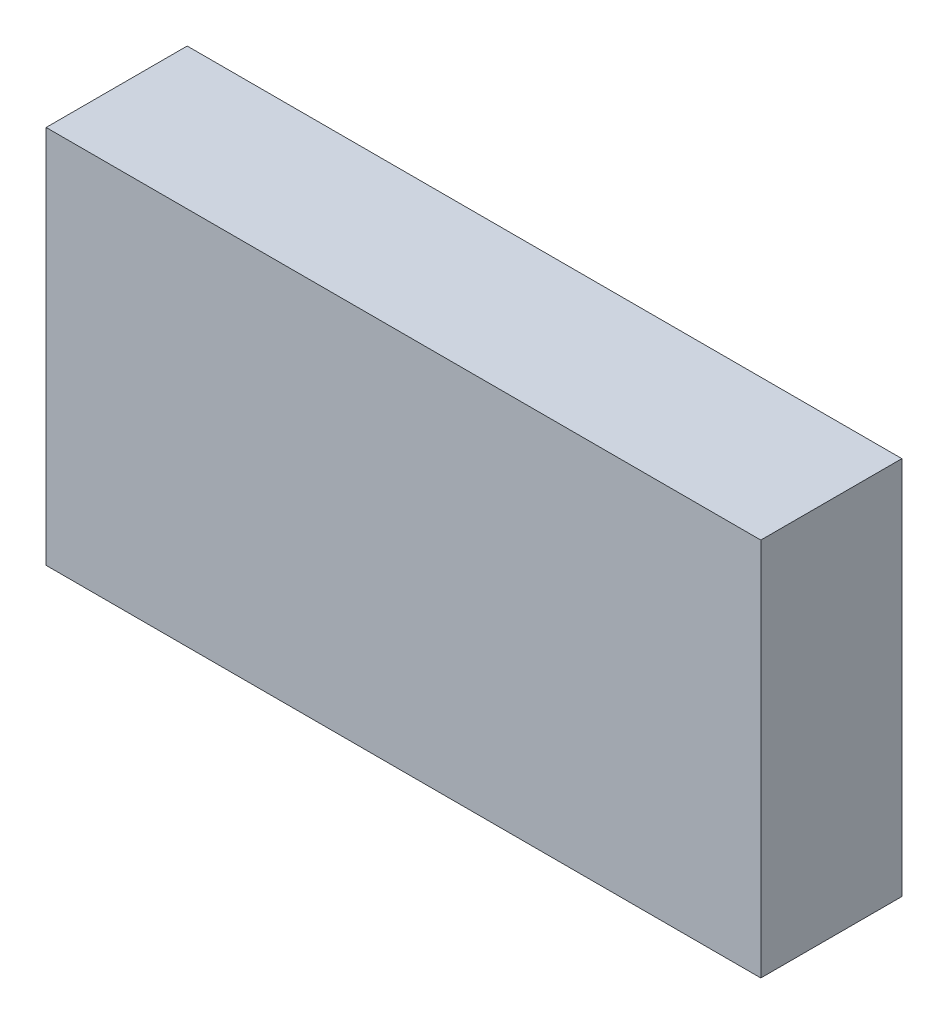
ISO-10303-21;
HEADER;
FILE_DESCRIPTION(('STEP AP214'),'2;1');
FILE_NAME('part.step','',(''),(''),'','','');
FILE_SCHEMA(('AUTOMOTIVE_DESIGN { 1 0 10303 214 1 1 1 1 }'));
ENDSEC;
DATA;
#1=APPLICATION_CONTEXT('core data for automotive mechanical design processes');
#2=APPLICATION_PROTOCOL_DEFINITION('international standard','automotive_design',2000,#1);
#3=PRODUCT_CONTEXT('',#1,'mechanical');
#4=PRODUCT('Part','Part','',(#3));
#5=PRODUCT_RELATED_PRODUCT_CATEGORY('part','',(#4));
#6=PRODUCT_DEFINITION_FORMATION('','',#4);
#7=PRODUCT_DEFINITION_CONTEXT('part definition',#1,'design');
#8=PRODUCT_DEFINITION('design','',#6,#7);
#9=PRODUCT_DEFINITION_SHAPE('','',#8);
#10=(LENGTH_UNIT() NAMED_UNIT(*) SI_UNIT(.MILLI.,.METRE.));
#11=(NAMED_UNIT(*) PLANE_ANGLE_UNIT() SI_UNIT($,.RADIAN.));
#12=(NAMED_UNIT(*) SI_UNIT($,.STERADIAN.) SOLID_ANGLE_UNIT());
#13=UNCERTAINTY_MEASURE_WITH_UNIT(LENGTH_MEASURE(1.E-05),#10,'distance_accuracy_value','');
#14=(GEOMETRIC_REPRESENTATION_CONTEXT(3) GLOBAL_UNCERTAINTY_ASSIGNED_CONTEXT((#13)) GLOBAL_UNIT_ASSIGNED_CONTEXT((#10,
#11,#12)) REPRESENTATION_CONTEXT('',''));
#15=CARTESIAN_POINT('',(0.,0.,0.));
#16=DIRECTION('',(0.,0.,1.));
#17=DIRECTION('',(1.,0.,0.));
#18=AXIS2_PLACEMENT_3D('',#15,#16,#17);
#19=CARTESIAN_POINT('',(-24.3787859940312,13.1516801351381,10.));
#20=DIRECTION('',(1.,0.,0.));
#21=DIRECTION('',(0.,0.,-1.));
#22=AXIS2_PLACEMENT_3D('',#19,#20,#21);
#23=PLANE('',#22);
#24=DIRECTION('',(0.,-1.,0.));
#25=VECTOR('',#24,1.);
#26=CARTESIAN_POINT('',(-24.3787859940312,13.1516801351381,0.));
#27=LINE('',#26,#25);
#28=CARTESIAN_POINT('',(-24.3787859940312,13.1516801351381,0.));
#29=VERTEX_POINT('',#28);
#30=CARTESIAN_POINT('',(-24.3787859940312,-13.7348848120382,0.));
#31=VERTEX_POINT('',#30);
#32=EDGE_CURVE('E96',#29,#31,#27,.T.);
#33=ORIENTED_EDGE('',*,*,#32,.T.);
#34=DIRECTION('',(0.,0.,-1.));
#35=VECTOR('',#34,1.);
#36=CARTESIAN_POINT('',(-24.3787859940312,-13.7348848120382,10.));
#37=LINE('',#36,#35);
#38=CARTESIAN_POINT('',(-24.3787859940312,-13.7348848120382,10.));
#39=VERTEX_POINT('',#38);
#40=EDGE_CURVE('E11',#39,#31,#37,.T.);
#41=ORIENTED_EDGE('',*,*,#40,.F.);
#42=DIRECTION('',(0.,-1.,0.));
#43=VECTOR('',#42,1.);
#44=CARTESIAN_POINT('',(-24.3787859940312,13.1516801351381,10.));
#45=LINE('',#44,#43);
#46=CARTESIAN_POINT('',(-24.3787859940312,13.1516801351381,10.));
#47=VERTEX_POINT('',#46);
#48=EDGE_CURVE('E82',#47,#39,#45,.T.);
#49=ORIENTED_EDGE('',*,*,#48,.F.);
#50=DIRECTION('',(0.,0.,-1.));
#51=VECTOR('',#50,1.);
#52=CARTESIAN_POINT('',(-24.3787859940312,13.1516801351381,10.));
#53=LINE('',#52,#51);
#54=EDGE_CURVE('E49',#47,#29,#53,.T.);
#55=ORIENTED_EDGE('',*,*,#54,.T.);
#56=EDGE_LOOP('',(#33,#41,#49,#55));
#57=FACE_BOUND('',#56,.T.);
#58=ADVANCED_FACE('F33',(#57),#23,.F.);
#59=CARTESIAN_POINT('',(-24.3787859940312,-13.7348848120382,10.));
#60=DIRECTION('',(0.,1.,0.));
#61=DIRECTION('',(0.,0.,1.));
#62=AXIS2_PLACEMENT_3D('',#59,#60,#61);
#63=PLANE('',#62);
#64=DIRECTION('',(1.,0.,0.));
#65=VECTOR('',#64,1.);
#66=CARTESIAN_POINT('',(-24.3787859940312,-13.7348848120382,0.));
#67=LINE('',#66,#65);
#68=CARTESIAN_POINT('',(26.2866547787439,-13.7348848120382,0.));
#69=VERTEX_POINT('',#68);
#70=EDGE_CURVE('E87',#31,#69,#67,.T.);
#71=ORIENTED_EDGE('',*,*,#70,.T.);
#72=DIRECTION('',(0.,0.,-1.));
#73=VECTOR('',#72,1.);
#74=CARTESIAN_POINT('',(26.2866547787439,-13.7348848120382,10.));
#75=LINE('',#74,#73);
#76=CARTESIAN_POINT('',(26.2866547787439,-13.7348848120382,10.));
#77=VERTEX_POINT('',#76);
#78=EDGE_CURVE('E41',#77,#69,#75,.T.);
#79=ORIENTED_EDGE('',*,*,#78,.F.);
#80=DIRECTION('',(1.,0.,0.));
#81=VECTOR('',#80,1.);
#82=CARTESIAN_POINT('',(-24.3787859940312,-13.7348848120382,10.));
#83=LINE('',#82,#81);
#84=EDGE_CURVE('E74',#39,#77,#83,.T.);
#85=ORIENTED_EDGE('',*,*,#84,.F.);
#86=ORIENTED_EDGE('',*,*,#40,.T.);
#87=EDGE_LOOP('',(#71,#79,#85,#86));
#88=FACE_BOUND('',#87,.T.);
#89=ADVANCED_FACE('F86',(#88),#63,.F.);
#90=CARTESIAN_POINT('',(26.2866547787439,13.1516801351381,10.));
#91=DIRECTION('',(1.,0.,0.));
#92=DIRECTION('',(0.,0.,-1.));
#93=AXIS2_PLACEMENT_3D('',#90,#91,#92);
#94=PLANE('',#93);
#95=DIRECTION('',(0.,-1.,0.));
#96=VECTOR('',#95,1.);
#97=CARTESIAN_POINT('',(26.2866547787439,13.1516801351381,0.));
#98=LINE('',#97,#96);
#99=CARTESIAN_POINT('',(26.2866547787439,13.1516801351381,0.));
#100=VERTEX_POINT('',#99);
#101=EDGE_CURVE('E99',#100,#69,#98,.T.);
#102=ORIENTED_EDGE('',*,*,#101,.F.);
#103=DIRECTION('',(0.,0.,-1.));
#104=VECTOR('',#103,1.);
#105=CARTESIAN_POINT('',(26.2866547787439,13.1516801351381,10.));
#106=LINE('',#105,#104);
#107=CARTESIAN_POINT('',(26.2866547787439,13.1516801351381,10.));
#108=VERTEX_POINT('',#107);
#109=EDGE_CURVE('E63',#108,#100,#106,.T.);
#110=ORIENTED_EDGE('',*,*,#109,.F.);
#111=DIRECTION('',(0.,-1.,0.));
#112=VECTOR('',#111,1.);
#113=CARTESIAN_POINT('',(26.2866547787439,13.1516801351381,10.));
#114=LINE('',#113,#112);
#115=EDGE_CURVE('E81',#108,#77,#114,.T.);
#116=ORIENTED_EDGE('',*,*,#115,.T.);
#117=ORIENTED_EDGE('',*,*,#78,.T.);
#118=EDGE_LOOP('',(#102,#110,#116,#117));
#119=FACE_BOUND('',#118,.T.);
#120=ADVANCED_FACE('F90',(#119),#94,.T.);
#121=CARTESIAN_POINT('',(-24.3787859940312,13.1516801351381,10.));
#122=DIRECTION('',(0.,1.,0.));
#123=DIRECTION('',(0.,0.,1.));
#124=AXIS2_PLACEMENT_3D('',#121,#122,#123);
#125=PLANE('',#124);
#126=DIRECTION('',(1.,0.,0.));
#127=VECTOR('',#126,1.);
#128=CARTESIAN_POINT('',(-24.3787859940312,13.1516801351381,0.));
#129=LINE('',#128,#127);
#130=EDGE_CURVE('E101',#29,#100,#129,.T.);
#131=ORIENTED_EDGE('',*,*,#130,.F.);
#132=ORIENTED_EDGE('',*,*,#54,.F.);
#133=DIRECTION('',(1.,0.,0.));
#134=VECTOR('',#133,1.);
#135=CARTESIAN_POINT('',(-24.3787859940312,13.1516801351381,10.));
#136=LINE('',#135,#134);
#137=EDGE_CURVE('E91',#47,#108,#136,.T.);
#138=ORIENTED_EDGE('',*,*,#137,.T.);
#139=ORIENTED_EDGE('',*,*,#109,.T.);
#140=EDGE_LOOP('',(#131,#132,#138,#139));
#141=FACE_BOUND('',#140,.T.);
#142=ADVANCED_FACE('F107',(#141),#125,.T.);
#143=CARTESIAN_POINT('',(0.,0.,10.));
#144=DIRECTION('',(0.,0.,1.));
#145=DIRECTION('',(1.,0.,0.));
#146=AXIS2_PLACEMENT_3D('',#143,#144,#145);
#147=PLANE('',#146);
#148=ORIENTED_EDGE('',*,*,#48,.T.);
#149=ORIENTED_EDGE('',*,*,#84,.T.);
#150=ORIENTED_EDGE('',*,*,#115,.F.);
#151=ORIENTED_EDGE('',*,*,#137,.F.);
#152=EDGE_LOOP('',(#148,#149,#150,#151));
#153=FACE_BOUND('',#152,.T.);
#154=ADVANCED_FACE('F78',(#153),#147,.T.);
#155=CARTESIAN_POINT('',(0.,0.,0.));
#156=DIRECTION('',(0.,0.,1.));
#157=DIRECTION('',(1.,0.,0.));
#158=AXIS2_PLACEMENT_3D('',#155,#156,#157);
#159=PLANE('',#158);
#160=ORIENTED_EDGE('',*,*,#32,.F.);
#161=ORIENTED_EDGE('',*,*,#130,.T.);
#162=ORIENTED_EDGE('',*,*,#101,.T.);
#163=ORIENTED_EDGE('',*,*,#70,.F.);
#164=EDGE_LOOP('',(#160,#161,#162,#163));
#165=FACE_BOUND('',#164,.T.);
#166=ADVANCED_FACE('F106',(#165),#159,.F.);
#167=CLOSED_SHELL('',(#58,#89,#120,#142,#154,#166));
#168=MANIFOLD_SOLID_BREP('B2',#167);
#169=ADVANCED_BREP_SHAPE_REPRESENTATION('',(#18,#168),#14);
#170=SHAPE_DEFINITION_REPRESENTATION(#9,#169);
ENDSEC;
END-ISO-10303-21;
